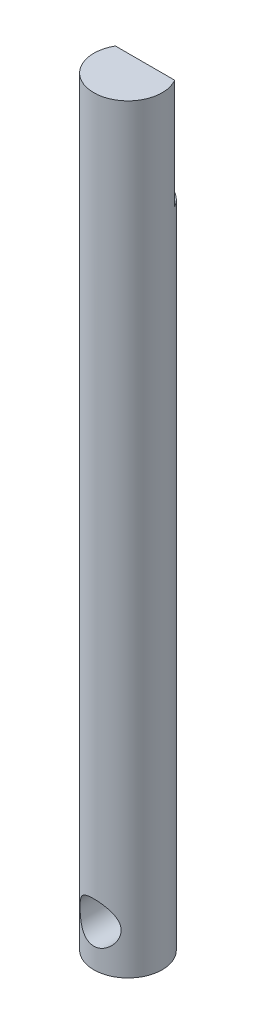
ISO-10303-21;
HEADER;
FILE_DESCRIPTION(('STEP AP214'),'2;1');
FILE_NAME('part.step','',(''),(''),'','','');
FILE_SCHEMA(('AUTOMOTIVE_DESIGN { 1 0 10303 214 1 1 1 1 }'));
ENDSEC;
DATA;
#1=APPLICATION_CONTEXT('core data for automotive mechanical design processes');
#2=APPLICATION_PROTOCOL_DEFINITION('international standard','automotive_design',2000,#1);
#3=PRODUCT_CONTEXT('',#1,'mechanical');
#4=PRODUCT('Part','Part','',(#3));
#5=PRODUCT_RELATED_PRODUCT_CATEGORY('part','',(#4));
#6=PRODUCT_DEFINITION_FORMATION('','',#4);
#7=PRODUCT_DEFINITION_CONTEXT('part definition',#1,'design');
#8=PRODUCT_DEFINITION('design','',#6,#7);
#9=PRODUCT_DEFINITION_SHAPE('','',#8);
#10=(LENGTH_UNIT() NAMED_UNIT(*) SI_UNIT(.MILLI.,.METRE.));
#11=(NAMED_UNIT(*) PLANE_ANGLE_UNIT() SI_UNIT($,.RADIAN.));
#12=(NAMED_UNIT(*) SI_UNIT($,.STERADIAN.) SOLID_ANGLE_UNIT());
#13=UNCERTAINTY_MEASURE_WITH_UNIT(LENGTH_MEASURE(1.E-05),#10,'distance_accuracy_value','');
#14=(GEOMETRIC_REPRESENTATION_CONTEXT(3) GLOBAL_UNCERTAINTY_ASSIGNED_CONTEXT((#13)) GLOBAL_UNIT_ASSIGNED_CONTEXT((#10,
#11,#12)) REPRESENTATION_CONTEXT('',''));
#15=CARTESIAN_POINT('',(0.,0.,0.));
#16=DIRECTION('',(0.,0.,1.));
#17=DIRECTION('',(1.,0.,0.));
#18=AXIS2_PLACEMENT_3D('',#15,#16,#17);
#19=CARTESIAN_POINT('',(0.,88.138,0.));
#20=DIRECTION('',(0.,-1.,0.));
#21=DIRECTION('',(0.,0.,-1.));
#22=AXIS2_PLACEMENT_3D('',#19,#20,#21);
#23=CYLINDRICAL_SURFACE('',#22,3.96875);
#24=CARTESIAN_POINT('',(0.,75.438,0.));
#25=DIRECTION('',(0.,1.,0.));
#26=DIRECTION('',(0.,0.,1.));
#27=AXIS2_PLACEMENT_3D('',#24,#25,#26);
#28=CIRCLE('',#27,3.96875);
#29=CARTESIAN_POINT('',(3.43703832126949,75.438,-1.984375));
#30=VERTEX_POINT('',#29);
#31=CARTESIAN_POINT('',(-3.43703832126949,75.438,-1.984375));
#32=VERTEX_POINT('',#31);
#33=EDGE_CURVE('E11',#30,#32,#28,.T.);
#34=ORIENTED_EDGE('',*,*,#33,.F.);
#35=DIRECTION('',(0.,1.,0.));
#36=VECTOR('',#35,1.);
#37=CARTESIAN_POINT('',(3.43703832126949,75.438,-1.984375));
#38=LINE('',#37,#36);
#39=CARTESIAN_POINT('',(3.43703832126949,88.138,-1.984375));
#40=VERTEX_POINT('',#39);
#41=EDGE_CURVE('E59',#30,#40,#38,.T.);
#42=ORIENTED_EDGE('',*,*,#41,.T.);
#43=CARTESIAN_POINT('',(0.,88.138,0.));
#44=DIRECTION('',(0.,1.,0.));
#45=DIRECTION('',(0.,0.,1.));
#46=AXIS2_PLACEMENT_3D('',#43,#44,#45);
#47=CIRCLE('',#46,3.96875);
#48=CARTESIAN_POINT('',(-3.43703832126949,88.138,-1.984375));
#49=VERTEX_POINT('',#48);
#50=EDGE_CURVE('E45',#49,#40,#47,.T.);
#51=ORIENTED_EDGE('',*,*,#50,.F.);
#52=DIRECTION('',(0.,1.,0.));
#53=VECTOR('',#52,1.);
#54=CARTESIAN_POINT('',(-3.43703832126949,75.438,-1.984375));
#55=LINE('',#54,#53);
#56=EDGE_CURVE('E53',#32,#49,#55,.T.);
#57=ORIENTED_EDGE('',*,*,#56,.F.);
#58=EDGE_LOOP('',(#34,#42,#51,#57));
#59=FACE_BOUND('',#58,.T.);
#60=CARTESIAN_POINT('',(0.,0.,0.));
#61=DIRECTION('',(0.,1.,0.));
#62=DIRECTION('',(0.,0.,1.));
#63=AXIS2_PLACEMENT_3D('',#60,#61,#62);
#64=CIRCLE('',#63,3.96875);
#65=CARTESIAN_POINT('',(0.,0.,3.96875));
#66=VERTEX_POINT('',#65);
#67=EDGE_CURVE('E73',#66,#66,#64,.T.);
#68=ORIENTED_EDGE('',*,*,#67,.T.);
#69=EDGE_LOOP('',(#68));
#70=FACE_BOUND('',#69,.T.);
#71=CARTESIAN_POINT('',(2.38125,4.7625,3.175));
#72=CARTESIAN_POINT('',(2.38123931413589,4.88223472074754,3.17501620784583));
#73=CARTESIAN_POINT('',(2.3721467051183,5.00209113742671,3.18189076425157));
#74=CARTESIAN_POINT('',(2.3364071600494,5.23770034888566,3.20821304283393));
#75=CARTESIAN_POINT('',(2.30974190390683,5.35344872803292,3.22767388625494));
#76=CARTESIAN_POINT('',(2.24065162856331,5.57701400817754,3.27600394421509));
#77=CARTESIAN_POINT('',(2.19834037506276,5.68488159306217,3.30480506192768));
#78=CARTESIAN_POINT('',(2.0995152620506,5.89190864556013,3.36845075278641));
#79=CARTESIAN_POINT('',(2.04299716610543,5.99106550374019,3.40329712764621));
#80=CARTESIAN_POINT('',(1.90930666871768,6.19116852907624,3.48025409400087));
#81=CARTESIAN_POINT('',(1.83045382065802,6.29085112557773,3.52273193188991));
#82=CARTESIAN_POINT('',(1.65777549869418,6.4766267048173,3.60721635051971));
#83=CARTESIAN_POINT('',(1.56393880388571,6.56270940616992,3.6492225526346));
#84=CARTESIAN_POINT('',(1.35166474959328,6.72803737815932,3.73341215272031));
#85=CARTESIAN_POINT('',(1.2316650400055,6.80554019912921,3.77512474900805));
#86=CARTESIAN_POINT('',(0.977351089694172,6.93866044631606,3.84879511490096));
#87=CARTESIAN_POINT('',(0.843050125234861,6.99429794946747,3.88076182718856));
#88=CARTESIAN_POINT('',(0.577487107669791,7.07643352470831,3.92860193213035));
#89=CARTESIAN_POINT('',(0.447158583140489,7.10520607230055,3.94572020024682));
#90=CARTESIAN_POINT('',(0.182515683787255,7.14048420027954,3.96676466081873));
#91=CARTESIAN_POINT('',(0.0482051715956122,7.14701069025946,3.97070324110932));
#92=CARTESIAN_POINT('',(-0.202624187963961,7.13801317593233,3.96531104184117));
#93=CARTESIAN_POINT('',(-0.319284084681314,7.12512302716372,3.95756507053819));
#94=CARTESIAN_POINT('',(-0.54842452727131,7.08266332445113,3.9323644611597));
#95=CARTESIAN_POINT('',(-0.660904763171284,7.05309253605584,3.91490910454213));
#96=CARTESIAN_POINT('',(-0.879565138992147,6.97838716919925,3.87167290181286));
#97=CARTESIAN_POINT('',(-0.985704929504917,6.93316326545073,3.84584432834103));
#98=CARTESIAN_POINT('',(-1.18901949795084,6.82881442173306,3.78792799758094));
#99=CARTESIAN_POINT('',(-1.28619193842193,6.76968587149975,3.7558386150776));
#100=CARTESIAN_POINT('',(-1.48125539901093,6.63124294022526,3.68360207459776));
#101=CARTESIAN_POINT('',(-1.57784587752435,6.5503610553241,3.64295027827041));
#102=CARTESIAN_POINT('',(-1.75690952099644,6.37475846310266,3.56005692253521));
#103=CARTESIAN_POINT('',(-1.83936324567026,6.28001902578805,3.5178132698538));
#104=CARTESIAN_POINT('',(-1.9974692996706,6.06638771765302,3.43076331794018));
#105=CARTESIAN_POINT('',(-2.07122606445284,5.9459692222407,3.38622737457491));
#106=CARTESIAN_POINT('',(-2.19705582287528,5.69165385727978,3.30598271288571));
#107=CARTESIAN_POINT('',(-2.24916876092986,5.55778238810003,3.27025778349673));
#108=CARTESIAN_POINT('',(-2.3189802660698,5.31432510940414,3.22097185999589));
#109=CARTESIAN_POINT('',(-2.34200546562127,5.20693549636391,3.20411298175935));
#110=CARTESIAN_POINT('',(-2.37300885445804,4.9889193935149,3.18122539365008));
#111=CARTESIAN_POINT('',(-2.38100454359656,4.87829682073029,3.17518408855049));
#112=CARTESIAN_POINT('',(-2.38148465215246,4.65684920463448,3.17482401462767));
#113=CARTESIAN_POINT('',(-2.37394758190643,4.54602409304185,3.18052148646831));
#114=CARTESIAN_POINT('',(-2.34378960554029,4.3275450899267,3.20280539335795));
#115=CARTESIAN_POINT('',(-2.32115677666219,4.21989377532771,3.21940043523978));
#116=CARTESIAN_POINT('',(-2.26200199017831,4.01047811205801,3.26122931916184));
#117=CARTESIAN_POINT('',(-2.22549738550229,3.90870659054855,3.28645236406269));
#118=CARTESIAN_POINT('',(-2.13989054220082,3.71240410022504,3.34282319991929));
#119=CARTESIAN_POINT('',(-2.09078355158026,3.61787588014855,3.37397322461947));
#120=CARTESIAN_POINT('',(-1.97115855270094,3.42068148378842,3.4454594530564));
#121=CARTESIAN_POINT('',(-1.8983765948624,3.31962038848028,3.48643934259368));
#122=CARTESIAN_POINT('',(-1.73811058333059,3.1300963281591,3.56904556554685));
#123=CARTESIAN_POINT('',(-1.65061246138325,3.04164556921593,3.61067248261287));
#124=CARTESIAN_POINT('',(-1.44983152786488,2.86825885962661,3.69626467870624));
#125=CARTESIAN_POINT('',(-1.33467533921927,2.78527540101155,3.73983021013664));
#126=CARTESIAN_POINT('',(-1.08915811392643,2.64015904246199,3.81853851331335));
#127=CARTESIAN_POINT('',(-0.958807236462238,2.57801231760852,3.85368686531372));
#128=CARTESIAN_POINT('',(-0.759715228546243,2.50468418496178,3.89589665176102));
#129=CARTESIAN_POINT('',(-0.695376067352316,2.48403496820275,3.90791769825286));
#130=CARTESIAN_POINT('',(-0.564725937170375,2.44819362459675,3.92892153724814));
#131=CARTESIAN_POINT('',(-0.498416095806916,2.43299843965358,3.93790603219198));
#132=CARTESIAN_POINT('',(-0.364425103584375,2.4083159045828,3.95255728323433));
#133=CARTESIAN_POINT('',(-0.296744918984185,2.3988246680655,3.95822629826682));
#134=CARTESIAN_POINT('',(-0.160642723848077,2.38568983018699,3.96608457344425));
#135=CARTESIAN_POINT('',(-0.092220811187214,2.38204546653167,3.96827428720753));
#136=CARTESIAN_POINT('',(0.0948686831517515,2.38019555821153,3.96937995495305));
#137=CARTESIAN_POINT('',(0.213687973881792,2.3879166276393,3.96473062915838));
#138=CARTESIAN_POINT('',(0.447933352930465,2.42076452489845,3.94514695976006));
#139=CARTESIAN_POINT('',(0.56335940343889,2.44589154660436,3.93021250159646));
#140=CARTESIAN_POINT('',(0.786037640969769,2.5117747365273,3.8917461413424));
#141=CARTESIAN_POINT('',(0.893391101271552,2.55227425717519,3.86835570370078));
#142=CARTESIAN_POINT('',(1.09979294389566,2.64737909545749,3.81481575221857));
#143=CARTESIAN_POINT('',(1.19883945722153,2.70198757627721,3.78466472287475));
#144=CARTESIAN_POINT('',(1.39741804935755,2.83039400073878,3.71623317695958));
#145=CARTESIAN_POINT('',(1.49583553622304,2.90563158169674,3.6774254602797));
#146=CARTESIAN_POINT('',(1.67941244063953,3.06983230919094,3.59730522750099));
#147=CARTESIAN_POINT('',(1.7645569581074,3.1588106611464,3.55598996769813));
#148=CARTESIAN_POINT('',(1.93025667547195,3.36119339571774,3.46913493817352));
#149=CARTESIAN_POINT('',(2.00886062955329,3.47626440832791,3.42372385998186));
#150=CARTESIAN_POINT('',(2.14561454940186,3.72027209749433,3.33972512891919));
#151=CARTESIAN_POINT('',(2.20377514938699,3.84920151947312,3.30113393369389));
#152=CARTESIAN_POINT('',(2.29293899954162,4.10699917026281,3.23977431933933));
#153=CARTESIAN_POINT('',(2.32583792664035,4.23493153919445,3.21593575791118));
#154=CARTESIAN_POINT('',(2.35896288169757,4.43076826653611,3.19162018222262));
#155=CARTESIAN_POINT('',(2.36730053600766,4.49667749851883,3.1854222210257));
#156=CARTESIAN_POINT('',(2.3784467219365,4.62921197351613,3.17710787485344));
#157=CARTESIAN_POINT('',(2.38125594940561,4.69583712535797,3.17499097620483));
#158=CARTESIAN_POINT('',(2.38125,4.7625,3.175));
#159=B_SPLINE_CURVE_WITH_KNOTS('',3,(#71,#72,#73,#74,#75,#76,#77,#78,#79,#80,#81,#82,#83,#84,
#85,#86,#87,#88,#89,#90,#91,#92,#93,#94,#95,#96,#97,#98,#99,#100,#101,#102,#103,#104,#105,#106,
#107,#108,#109,#110,#111,#112,#113,#114,#115,#116,#117,#118,#119,#120,#121,#122,#123,#124,#125,
#126,#127,#128,#129,#130,#131,#132,#133,#134,#135,#136,#137,#138,#139,#140,#141,#142,#143,#144,
#145,#146,#147,#148,#149,#150,#151,#152,#153,#154,#155,#156,#157,#158),.UNSPECIFIED.,.T.,.F.,(4,
2,2,2,2,2,2,2,2,2,2,2,2,2,2,2,2,2,2,2,2,2,2,2,2,2,2,2,2,2,2,2,2,2,2,2,2,2,2,2,2,2,2,4),(0.,
0.35891033357076,0.718195436750097,1.07491787970453,1.43174682256767,1.83220459049115,
2.23296366660415,2.67700375411242,3.12063516198049,3.52192162742852,3.92283081011879,
4.27402832242288,4.62525182852099,4.97851358625235,5.33186716790582,5.72742710967025,
6.1235267207041,6.56552965437756,7.00671319248262,7.33863623164378,7.6701725508738,
8.00216786045318,8.3344256937287,8.66626924932791,8.99823811785591,9.39005358592746,
9.78224577043364,10.2254340197096,10.6683276343851,10.8739691881023,11.0794952570362,
11.2848811313883,11.4902402260977,11.8457822637211,12.2013282615788,12.5511823061084,
12.9011148550009,13.28903632571,13.6773901843904,14.1149924496567,14.5523667450582,
14.9523736864948,15.1522238762049,15.352048909622),.UNSPECIFIED.);
#160=CARTESIAN_POINT('',(2.38125,4.7625,3.175));
#161=VERTEX_POINT('',#160);
#162=EDGE_CURVE('E80',#161,#161,#159,.T.);
#163=ORIENTED_EDGE('',*,*,#162,.F.);
#164=EDGE_LOOP('',(#163));
#165=FACE_BOUND('',#164,.T.);
#166=CARTESIAN_POINT('',(0.,7.14375,-3.96875));
#167=CARTESIAN_POINT('',(0.121806205735399,7.14374234570302,-3.96874307021178));
#168=CARTESIAN_POINT('',(0.243811288996028,7.13433792382364,-3.96308084544484));
#169=CARTESIAN_POINT('',(0.48414926799921,7.09719795461843,-3.94096748575955));
#170=CARTESIAN_POINT('',(0.602472352815268,7.06941720268909,-3.92448974613585));
#171=CARTESIAN_POINT('',(0.831455854573975,6.99708656867491,-3.88241466334821));
#172=CARTESIAN_POINT('',(0.942151086101978,6.95261980663108,-3.85686255670128));
#173=CARTESIAN_POINT('',(1.154160676362,6.848696743418,-3.79881398007121));
#174=CARTESIAN_POINT('',(1.25547735550189,6.78924416361205,-3.76631923442839));
#175=CARTESIAN_POINT('',(1.45462509162895,6.65198245595299,-3.69419759574591));
#176=CARTESIAN_POINT('',(1.55159712817317,6.57311725684162,-3.65421532458502));
#177=CARTESIAN_POINT('',(1.73177629649963,6.40164581571297,-3.5723582250924));
#178=CARTESIAN_POINT('',(1.81496549333624,6.30902196271686,-3.53048101974548));
#179=CARTESIAN_POINT('',(1.97556432245035,6.09929642652319,-3.44346318807448));
#180=CARTESIAN_POINT('',(2.05101454100791,5.9805859384324,-3.39855203090996));
#181=CARTESIAN_POINT('',(2.18061282477299,5.72953106511114,-3.31689553505271));
#182=CARTESIAN_POINT('',(2.23479546255782,5.59720925218348,-3.2801369861553));
#183=CARTESIAN_POINT('',(2.30886955231782,5.35527813460581,-3.22825474582438));
#184=CARTESIAN_POINT('',(2.33388213180796,5.24790035234626,-3.21005014473623));
#185=CARTESIAN_POINT('',(2.36880673539109,5.02951160097933,-3.18437114426404));
#186=CARTESIAN_POINT('',(2.37873753413953,4.91850532506051,-3.17688340459346));
#187=CARTESIAN_POINT('',(2.38292495409069,4.69580675347277,-3.17374464386445));
#188=CARTESIAN_POINT('',(2.37715081891655,4.58411353969734,-3.17811684915208));
#189=CARTESIAN_POINT('',(2.35023120278798,4.36359494197439,-3.1980705263449));
#190=CARTESIAN_POINT('',(2.32907415978649,4.25477177899546,-3.21366042956536));
#191=CARTESIAN_POINT('',(2.27288603682829,4.04410824812021,-3.25363183933094));
#192=CARTESIAN_POINT('',(2.23803773507132,3.94219582971333,-3.27789715983725));
#193=CARTESIAN_POINT('',(2.15574650557814,3.74539667407294,-3.33259195284582));
#194=CARTESIAN_POINT('',(2.10829896076346,3.65051252873353,-3.36302368410083));
#195=CARTESIAN_POINT('',(1.99259842154223,3.45283786780132,-3.43305326493925));
#196=CARTESIAN_POINT('',(1.92215826901388,3.35156526961218,-3.47332346479378));
#197=CARTESIAN_POINT('',(1.76674432704673,3.16122558952775,-3.55489849522693));
#198=CARTESIAN_POINT('',(1.68175664330228,3.07217032423071,-3.59620428239891));
#199=CARTESIAN_POINT('',(1.48560886119509,2.89621649841894,-3.68197518330787));
#200=CARTESIAN_POINT('',(1.37245192996111,2.81134815270413,-3.72607834289023));
#201=CARTESIAN_POINT('',(1.13070813757301,2.66203537855781,-3.80639110722138));
#202=CARTESIAN_POINT('',(1.00212957838902,2.59758002857272,-3.84260492974951));
#203=CARTESIAN_POINT('',(0.804659971855419,2.52029583645056,-3.88686374696583));
#204=CARTESIAN_POINT('',(0.740318728829909,2.49822496702928,-3.89965687767775));
#205=CARTESIAN_POINT('',(0.609508719434615,2.45956887164702,-3.92222730224868));
#206=CARTESIAN_POINT('',(0.543041166803436,2.44298057531414,-3.93200628389558));
#207=CARTESIAN_POINT('',(0.408577342724659,2.41556161694979,-3.94824298143627));
#208=CARTESIAN_POINT('',(0.340582228439874,2.40472674031332,-3.95470312839315));
#209=CARTESIAN_POINT('',(0.203693804314841,2.38897641336024,-3.96411432418266));
#210=CARTESIAN_POINT('',(0.134800622182059,2.38406013048972,-3.96706586656126));
#211=CARTESIAN_POINT('',(-0.0534387974766182,2.37887445459818,-3.97017215096845));
#212=CARTESIAN_POINT('',(-0.17308266390689,2.38457455530453,-3.96673796621643));
#213=CARTESIAN_POINT('',(-0.409326437846757,2.41367117909803,-3.94936624529476));
#214=CARTESIAN_POINT('',(-0.525926407032042,2.43706734333777,-3.93542892211172));
#215=CARTESIAN_POINT('',(-0.750206949813088,2.49958895663161,-3.89881624662925));
#216=CARTESIAN_POINT('',(-0.85803545731045,2.53831814212295,-3.87636158486212));
#217=CARTESIAN_POINT('',(-1.0656359242699,2.62997499694434,-3.82450815003608));
#218=CARTESIAN_POINT('',(-1.16540628960771,2.68290546677536,-3.79510800746138));
#219=CARTESIAN_POINT('',(-1.36525946350256,2.8075843090611,-3.72817216264567));
#220=CARTESIAN_POINT('',(-1.46430058499072,2.88071535680782,-3.69010884423643));
#221=CARTESIAN_POINT('',(-1.64945395371524,3.04068380898435,-3.61115399028643));
#222=CARTESIAN_POINT('',(-1.73555092583719,3.12753716285942,-3.57025919518201));
#223=CARTESIAN_POINT('',(-1.90392040693031,3.32567025319144,-3.48369609680025));
#224=CARTESIAN_POINT('',(-1.9842324257278,3.43865817055234,-3.43810021065051));
#225=CARTESIAN_POINT('',(-2.12479317868764,3.67858043662868,-3.35305689237869));
#226=CARTESIAN_POINT('',(-2.18506304989312,3.80549990355487,-3.3136030062348));
#227=CARTESIAN_POINT('',(-2.27238843648327,4.04216079830385,-3.25413543378437));
#228=CARTESIAN_POINT('',(-2.30380580213552,4.14969374580886,-3.23176359165702));
#229=CARTESIAN_POINT('',(-2.35130441458369,4.36964467401249,-3.19737749136505));
#230=CARTESIAN_POINT('',(-2.36740692376084,4.48205565475244,-3.1853488754151));
#231=CARTESIAN_POINT('',(-2.38337932195902,4.70912340367592,-3.17341958969507));
#232=CARTESIAN_POINT('',(-2.38318817105633,4.8237870077342,-3.17356452491172));
#233=CARTESIAN_POINT('',(-2.3664302517569,5.05125741901285,-3.18607627271717));
#234=CARTESIAN_POINT('',(-2.34985457900016,5.1640631826769,-3.19844973103919));
#235=CARTESIAN_POINT('',(-2.30251278774326,5.37922535404491,-3.23267681160577));
#236=CARTESIAN_POINT('',(-2.27246881934456,5.48182335491061,-3.25404497236337));
#237=CARTESIAN_POINT('',(-2.19969138351583,5.68061042379154,-3.3036748586733));
#238=CARTESIAN_POINT('',(-2.1569531372244,5.77679706147152,-3.33193917962294));
#239=CARTESIAN_POINT('',(-2.05246713626329,5.97585763442768,-3.39745616027652));
#240=CARTESIAN_POINT('',(-1.98880823822089,6.07749094707076,-3.43542256915816));
#241=CARTESIAN_POINT('',(-1.84746275935876,6.26964142103689,-3.51345727554353));
#242=CARTESIAN_POINT('',(-1.76976462726716,6.36014932472366,-3.5535272844518));
#243=CARTESIAN_POINT('',(-1.58766155526614,6.54264220656646,-3.63895670347329));
#244=CARTESIAN_POINT('',(-1.48096740934074,6.63245584082954,-3.68411161185473));
#245=CARTESIAN_POINT('',(-1.25165864689212,6.79307759023679,-3.76818072315365));
#246=CARTESIAN_POINT('',(-1.12903834692798,6.86387889279873,-3.80709268706678));
#247=CARTESIAN_POINT('',(-0.937436145759756,6.95255503833062,-3.8569944234416));
#248=CARTESIAN_POINT('',(-0.873323576124929,6.97891667059825,-3.87204852500772));
#249=CARTESIAN_POINT('',(-0.742507331764904,7.02609412604397,-3.89924459404993));
#250=CARTESIAN_POINT('',(-0.675805193267407,7.04691318137586,-3.91138825833351));
#251=CARTESIAN_POINT('',(-0.54054511135801,7.08263872009107,-3.93236073096452));
#252=CARTESIAN_POINT('',(-0.471993217932815,7.09756245122175,-3.9411992050838));
#253=CARTESIAN_POINT('',(-0.33352114633093,7.1213221733491,-3.95532236268431));
#254=CARTESIAN_POINT('',(-0.263602157828208,7.13016323458709,-3.96061000589102));
#255=CARTESIAN_POINT('',(-0.161229110789315,7.13850449320348,-3.96560445196523));
#256=CARTESIAN_POINT('',(-0.129027628560241,7.14047013157661,-3.96678267547137));
#257=CARTESIAN_POINT('',(-0.0645554229335699,7.14309392203678,-3.96835638143393));
#258=CARTESIAN_POINT('',(-0.032284697172969,7.14375202876905,-3.96875183673823));
#259=CARTESIAN_POINT('',(0.,7.14375,-3.96875));
#260=B_SPLINE_CURVE_WITH_KNOTS('',3,(#166,#167,#168,#169,#170,#171,#172,#173,#174,#175,#176,
#177,#178,#179,#180,#181,#182,#183,#184,#185,#186,#187,#188,#189,#190,#191,#192,#193,#194,#195,
#196,#197,#198,#199,#200,#201,#202,#203,#204,#205,#206,#207,#208,#209,#210,#211,#212,#213,#214,
#215,#216,#217,#218,#219,#220,#221,#222,#223,#224,#225,#226,#227,#228,#229,#230,#231,#232,#233,
#234,#235,#236,#237,#238,#239,#240,#241,#242,#243,#244,#245,#246,#247,#248,#249,#250,#251,#252,
#253,#254,#255,#256,#257,#258,#259),.UNSPECIFIED.,.T.,.F.,(4,2,2,2,2,2,2,2,2,2,2,2,2,2,2,2,2,2,
2,2,2,2,2,2,2,2,2,2,2,2,2,2,2,2,2,2,2,2,2,2,2,2,2,2,2,2,4),(0.,0.36528730210848,
0.731476546188019,1.09586535430252,1.46016376431274,1.852320252878,2.24498309471496,
2.68579303438819,3.12588339598695,3.45969954895818,3.79309980705067,4.12715346257277,
4.46145845822272,4.79144437304216,5.12155138073166,5.50937104919946,5.89756321125833,
6.33985520641947,6.78191016099577,6.98929298993746,7.19655948197018,7.40367393300126,
7.61075924635074,7.96826925974226,8.3257720236061,8.67458266434887,9.02346214136077,
9.40854074889024,9.79407027157289,10.2298401700684,10.66514902431,11.0064614401445,
11.3472993001652,11.6894140757405,12.0317148798709,12.3575241275306,12.6834561844519,
13.0594295011038,13.4357135834008,13.8734312659601,14.3113055847815,14.5238486781111,
14.7362675540863,14.9480602772745,15.1596762449402,15.2564921732081,15.3533114597009),.UNSPECIFIED.);
#261=CARTESIAN_POINT('',(0.,7.14375,-3.96875));
#262=VERTEX_POINT('',#261);
#263=EDGE_CURVE('E37',#262,#262,#260,.T.);
#264=ORIENTED_EDGE('',*,*,#263,.F.);
#265=EDGE_LOOP('',(#264));
#266=FACE_BOUND('',#265,.T.);
#267=ADVANCED_FACE('F33',(#59,#70,#165,#266),#23,.T.);
#268=CARTESIAN_POINT('',(0.,88.138,0.));
#269=DIRECTION('',(0.,1.,0.));
#270=DIRECTION('',(0.,0.,1.));
#271=AXIS2_PLACEMENT_3D('',#268,#269,#270);
#272=PLANE('',#271);
#273=DIRECTION('',(1.,0.,0.));
#274=VECTOR('',#273,1.);
#275=CARTESIAN_POINT('',(3.43703832126949,88.138,-1.984375));
#276=LINE('',#275,#274);
#277=EDGE_CURVE('E63',#49,#40,#276,.T.);
#278=ORIENTED_EDGE('',*,*,#277,.F.);
#279=ORIENTED_EDGE('',*,*,#50,.T.);
#280=EDGE_LOOP('',(#278,#279));
#281=FACE_BOUND('',#280,.T.);
#282=ADVANCED_FACE('F75',(#281),#272,.T.);
#283=CARTESIAN_POINT('',(0.,0.,0.));
#284=DIRECTION('',(0.,1.,0.));
#285=DIRECTION('',(0.,0.,1.));
#286=AXIS2_PLACEMENT_3D('',#283,#284,#285);
#287=PLANE('',#286);
#288=ORIENTED_EDGE('',*,*,#67,.F.);
#289=EDGE_LOOP('',(#288));
#290=FACE_BOUND('',#289,.T.);
#291=ADVANCED_FACE('F93',(#290),#287,.F.);
#292=CARTESIAN_POINT('',(0.,75.438,0.));
#293=DIRECTION('',(0.,1.,0.));
#294=DIRECTION('',(0.,0.,1.));
#295=AXIS2_PLACEMENT_3D('',#292,#293,#294);
#296=PLANE('',#295);
#297=ORIENTED_EDGE('',*,*,#33,.T.);
#298=DIRECTION('',(1.,0.,0.));
#299=VECTOR('',#298,1.);
#300=CARTESIAN_POINT('',(3.43703832126949,75.438,-1.984375));
#301=LINE('',#300,#299);
#302=EDGE_CURVE('E68',#32,#30,#301,.T.);
#303=ORIENTED_EDGE('',*,*,#302,.T.);
#304=EDGE_LOOP('',(#297,#303));
#305=FACE_BOUND('',#304,.T.);
#306=ADVANCED_FACE('F89',(#305),#296,.T.);
#307=CARTESIAN_POINT('',(3.43703832126949,75.438,-1.984375));
#308=DIRECTION('',(0.,0.,1.));
#309=DIRECTION('',(1.,0.,0.));
#310=AXIS2_PLACEMENT_3D('',#307,#308,#309);
#311=PLANE('',#310);
#312=ORIENTED_EDGE('',*,*,#277,.T.);
#313=ORIENTED_EDGE('',*,*,#41,.F.);
#314=ORIENTED_EDGE('',*,*,#302,.F.);
#315=ORIENTED_EDGE('',*,*,#56,.T.);
#316=EDGE_LOOP('',(#312,#313,#314,#315));
#317=FACE_BOUND('',#316,.T.);
#318=ADVANCED_FACE('F64',(#317),#311,.F.);
#319=CARTESIAN_POINT('',(0.,4.7625,-14.684375));
#320=DIRECTION('',(0.,0.,1.));
#321=DIRECTION('',(1.,0.,0.));
#322=AXIS2_PLACEMENT_3D('',#319,#320,#321);
#323=CYLINDRICAL_SURFACE('',#322,2.38125);
#324=ORIENTED_EDGE('',*,*,#162,.T.);
#325=EDGE_LOOP('',(#324));
#326=FACE_BOUND('',#325,.T.);
#327=ORIENTED_EDGE('',*,*,#263,.T.);
#328=EDGE_LOOP('',(#327));
#329=FACE_BOUND('',#328,.T.);
#330=ADVANCED_FACE('F84',(#326,#329),#323,.F.);
#331=CLOSED_SHELL('',(#267,#282,#291,#306,#318,#330));
#332=MANIFOLD_SOLID_BREP('B2',#331);
#333=ADVANCED_BREP_SHAPE_REPRESENTATION('',(#18,#332),#14);
#334=SHAPE_DEFINITION_REPRESENTATION(#9,#333);
ENDSEC;
END-ISO-10303-21;
